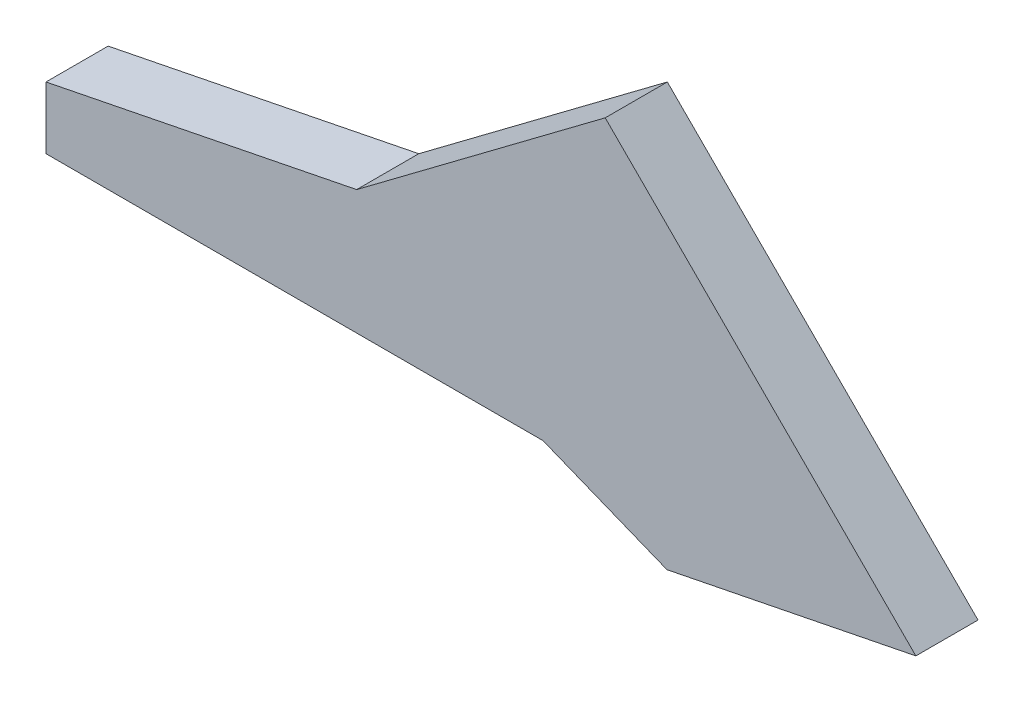
ISO-10303-21;
HEADER;
FILE_DESCRIPTION(('STEP AP214'),'2;1');
FILE_NAME('part.step','',(''),(''),'','','');
FILE_SCHEMA(('AUTOMOTIVE_DESIGN { 1 0 10303 214 1 1 1 1 }'));
ENDSEC;
DATA;
#1=APPLICATION_CONTEXT('core data for automotive mechanical design processes');
#2=APPLICATION_PROTOCOL_DEFINITION('international standard','automotive_design',2000,#1);
#3=PRODUCT_CONTEXT('',#1,'mechanical');
#4=PRODUCT('Part','Part','',(#3));
#5=PRODUCT_RELATED_PRODUCT_CATEGORY('part','',(#4));
#6=PRODUCT_DEFINITION_FORMATION('','',#4);
#7=PRODUCT_DEFINITION_CONTEXT('part definition',#1,'design');
#8=PRODUCT_DEFINITION('design','',#6,#7);
#9=PRODUCT_DEFINITION_SHAPE('','',#8);
#10=(LENGTH_UNIT() NAMED_UNIT(*) SI_UNIT(.MILLI.,.METRE.));
#11=(NAMED_UNIT(*) PLANE_ANGLE_UNIT() SI_UNIT($,.RADIAN.));
#12=(NAMED_UNIT(*) SI_UNIT($,.STERADIAN.) SOLID_ANGLE_UNIT());
#13=UNCERTAINTY_MEASURE_WITH_UNIT(LENGTH_MEASURE(1.E-05),#10,'distance_accuracy_value','');
#14=(GEOMETRIC_REPRESENTATION_CONTEXT(3) GLOBAL_UNCERTAINTY_ASSIGNED_CONTEXT((#13)) GLOBAL_UNIT_ASSIGNED_CONTEXT((#10,
#11,#12)) REPRESENTATION_CONTEXT('',''));
#15=CARTESIAN_POINT('',(0.,0.,0.));
#16=DIRECTION('',(0.,0.,1.));
#17=DIRECTION('',(1.,0.,0.));
#18=AXIS2_PLACEMENT_3D('',#15,#16,#17);
#19=CARTESIAN_POINT('',(-0.999999977648,0.,0.3));
#20=DIRECTION('',(-1.,0.,0.));
#21=DIRECTION('',(0.,-1.,0.));
#22=AXIS2_PLACEMENT_3D('',#19,#20,#21);
#23=PLANE('',#22);
#24=DIRECTION('',(0.,1.,0.));
#25=VECTOR('',#24,1.);
#26=CARTESIAN_POINT('',(-0.999999977648,-0.09999999776483,0.3));
#27=LINE('',#26,#25);
#28=CARTESIAN_POINT('',(-0.999999977648,-0.09999999776483,0.3));
#29=VERTEX_POINT('',#28);
#30=CARTESIAN_POINT('',(-0.999999977648,0.,0.3));
#31=VERTEX_POINT('',#30);
#32=EDGE_CURVE('E35',#29,#31,#27,.T.);
#33=ORIENTED_EDGE('',*,*,#32,.F.);
#34=DIRECTION('',(0.,0.,1.));
#35=VECTOR('',#34,1.);
#36=CARTESIAN_POINT('',(-0.999999977648,-0.09999999776483,0.3));
#37=LINE('',#36,#35);
#38=CARTESIAN_POINT('',(-0.999999977648,-0.09999999776483,0.4));
#39=VERTEX_POINT('',#38);
#40=EDGE_CURVE('E11',#29,#39,#37,.T.);
#41=ORIENTED_EDGE('',*,*,#40,.T.);
#42=DIRECTION('',(0.,-1.,0.));
#43=VECTOR('',#42,1.);
#44=CARTESIAN_POINT('',(-0.999999977648,-0.09999999776483,0.4));
#45=LINE('',#44,#43);
#46=CARTESIAN_POINT('',(-0.999999977648,0.,0.4));
#47=VERTEX_POINT('',#46);
#48=EDGE_CURVE('E98',#47,#39,#45,.T.);
#49=ORIENTED_EDGE('',*,*,#48,.F.);
#50=DIRECTION('',(0.,0.,1.));
#51=VECTOR('',#50,1.);
#52=CARTESIAN_POINT('',(-0.999999977648,0.,0.3));
#53=LINE('',#52,#51);
#54=EDGE_CURVE('E27',#31,#47,#53,.T.);
#55=ORIENTED_EDGE('',*,*,#54,.F.);
#56=EDGE_LOOP('',(#33,#41,#49,#55));
#57=FACE_BOUND('',#56,.T.);
#58=ADVANCED_FACE('F17',(#57),#23,.T.);
#59=CARTESIAN_POINT('',(-0.499999988824,0.09999999776483,0.3));
#60=DIRECTION('',(-0.196116135137992,0.980580675690959,0.));
#61=DIRECTION('',(-0.980580675690959,-0.196116135137992,0.));
#62=AXIS2_PLACEMENT_3D('',#59,#60,#61);
#63=PLANE('',#62);
#64=DIRECTION('',(0.980580675690959,0.196116135137992,0.));
#65=VECTOR('',#64,1.);
#66=CARTESIAN_POINT('',(-0.999999977648,0.,0.3));
#67=LINE('',#66,#65);
#68=CARTESIAN_POINT('',(-0.499999988824,0.09999999776483,0.3));
#69=VERTEX_POINT('',#68);
#70=EDGE_CURVE('E103',#31,#69,#67,.T.);
#71=ORIENTED_EDGE('',*,*,#70,.F.);
#72=ORIENTED_EDGE('',*,*,#54,.T.);
#73=DIRECTION('',(-0.980580675690959,-0.196116135137992,0.));
#74=VECTOR('',#73,1.);
#75=CARTESIAN_POINT('',(-0.999999977648,0.,0.4));
#76=LINE('',#75,#74);
#77=CARTESIAN_POINT('',(-0.499999988824,0.09999999776483,0.4));
#78=VERTEX_POINT('',#77);
#79=EDGE_CURVE('E100',#78,#47,#76,.T.);
#80=ORIENTED_EDGE('',*,*,#79,.F.);
#81=DIRECTION('',(0.,0.,1.));
#82=VECTOR('',#81,1.);
#83=CARTESIAN_POINT('',(-0.499999988824,0.09999999776483,0.3));
#84=LINE('',#83,#82);
#85=EDGE_CURVE('E124',#69,#78,#84,.T.);
#86=ORIENTED_EDGE('',*,*,#85,.F.);
#87=EDGE_LOOP('',(#71,#72,#80,#86));
#88=FACE_BOUND('',#87,.T.);
#89=ADVANCED_FACE('F133',(#88),#63,.T.);
#90=CARTESIAN_POINT('',(-0.09999999776483,0.399999991059,0.3));
#91=DIRECTION('',(-0.6,0.8,0.));
#92=DIRECTION('',(-0.8,-0.6,0.));
#93=AXIS2_PLACEMENT_3D('',#90,#91,#92);
#94=PLANE('',#93);
#95=DIRECTION('',(0.8,0.6,0.));
#96=VECTOR('',#95,1.);
#97=CARTESIAN_POINT('',(-0.499999988824,0.09999999776483,0.3));
#98=LINE('',#97,#96);
#99=CARTESIAN_POINT('',(-0.09999999776483,0.399999991059,0.3));
#100=VERTEX_POINT('',#99);
#101=EDGE_CURVE('E121',#69,#100,#98,.T.);
#102=ORIENTED_EDGE('',*,*,#101,.F.);
#103=ORIENTED_EDGE('',*,*,#85,.T.);
#104=DIRECTION('',(-0.8,-0.6,0.));
#105=VECTOR('',#104,1.);
#106=CARTESIAN_POINT('',(-0.499999988824,0.09999999776483,0.4));
#107=LINE('',#106,#105);
#108=CARTESIAN_POINT('',(-0.09999999776483,0.399999991059,0.4));
#109=VERTEX_POINT('',#108);
#110=EDGE_CURVE('E119',#109,#78,#107,.T.);
#111=ORIENTED_EDGE('',*,*,#110,.F.);
#112=DIRECTION('',(0.,0.,1.));
#113=VECTOR('',#112,1.);
#114=CARTESIAN_POINT('',(-0.09999999776483,0.399999991059,0.3));
#115=LINE('',#114,#113);
#116=EDGE_CURVE('E116',#100,#109,#115,.T.);
#117=ORIENTED_EDGE('',*,*,#116,.F.);
#118=EDGE_LOOP('',(#102,#103,#111,#117));
#119=FACE_BOUND('',#118,.T.);
#120=ADVANCED_FACE('F140',(#119),#94,.T.);
#121=CARTESIAN_POINT('',(0.399999991059,-0.09999999776483,0.3));
#122=DIRECTION('',(0.707106781186548,0.707106781186548,0.));
#123=DIRECTION('',(-0.707106781186548,0.707106781186548,0.));
#124=AXIS2_PLACEMENT_3D('',#121,#122,#123);
#125=PLANE('',#124);
#126=DIRECTION('',(0.707106781186548,-0.707106781186548,0.));
#127=VECTOR('',#126,1.);
#128=CARTESIAN_POINT('',(-0.09999999776483,0.399999991059,0.3));
#129=LINE('',#128,#127);
#130=CARTESIAN_POINT('',(0.399999991059,-0.09999999776483,0.3));
#131=VERTEX_POINT('',#130);
#132=EDGE_CURVE('E113',#100,#131,#129,.T.);
#133=ORIENTED_EDGE('',*,*,#132,.F.);
#134=ORIENTED_EDGE('',*,*,#116,.T.);
#135=DIRECTION('',(-0.707106781186548,0.707106781186548,0.));
#136=VECTOR('',#135,1.);
#137=CARTESIAN_POINT('',(-0.09999999776483,0.399999991059,0.4));
#138=LINE('',#137,#136);
#139=CARTESIAN_POINT('',(0.399999991059,-0.09999999776483,0.4));
#140=VERTEX_POINT('',#139);
#141=EDGE_CURVE('E111',#140,#109,#138,.T.);
#142=ORIENTED_EDGE('',*,*,#141,.F.);
#143=DIRECTION('',(0.,0.,1.));
#144=VECTOR('',#143,1.);
#145=CARTESIAN_POINT('',(0.399999991059,-0.09999999776483,0.3));
#146=LINE('',#145,#144);
#147=EDGE_CURVE('E109',#131,#140,#146,.T.);
#148=ORIENTED_EDGE('',*,*,#147,.F.);
#149=EDGE_LOOP('',(#133,#134,#142,#148));
#150=FACE_BOUND('',#149,.T.);
#151=ADVANCED_FACE('F142',(#150),#125,.T.);
#152=CARTESIAN_POINT('',(-0.0005978718502263,-0.180119570347,0.3));
#153=DIRECTION('',(0.196116135137992,-0.980580675690959,0.));
#154=DIRECTION('',(0.980580675690959,0.196116135137992,0.));
#155=AXIS2_PLACEMENT_3D('',#152,#153,#154);
#156=PLANE('',#155);
#157=DIRECTION('',(-0.980580675690959,-0.196116135137992,0.));
#158=VECTOR('',#157,1.);
#159=CARTESIAN_POINT('',(0.399999991059,-0.09999999776483,0.3));
#160=LINE('',#159,#158);
#161=CARTESIAN_POINT('',(-0.000597871850226,-0.180119570347,0.3));
#162=VERTEX_POINT('',#161);
#163=EDGE_CURVE('E107',#131,#162,#160,.T.);
#164=ORIENTED_EDGE('',*,*,#163,.F.);
#165=ORIENTED_EDGE('',*,*,#147,.T.);
#166=DIRECTION('',(0.980580675690959,0.196116135137992,0.));
#167=VECTOR('',#166,1.);
#168=CARTESIAN_POINT('',(0.399999991059,-0.09999999776483,0.4));
#169=LINE('',#168,#167);
#170=CARTESIAN_POINT('',(-0.000597871850226,-0.180119570347,0.4));
#171=VERTEX_POINT('',#170);
#172=EDGE_CURVE('E89',#171,#140,#169,.T.);
#173=ORIENTED_EDGE('',*,*,#172,.F.);
#174=DIRECTION('',(0.,0.,1.));
#175=VECTOR('',#174,1.);
#176=CARTESIAN_POINT('',(-0.0005978718502263,-0.180119570347,0.3));
#177=LINE('',#176,#175);
#178=EDGE_CURVE('E85',#162,#171,#177,.T.);
#179=ORIENTED_EDGE('',*,*,#178,.F.);
#180=EDGE_LOOP('',(#164,#165,#173,#179));
#181=FACE_BOUND('',#180,.T.);
#182=ADVANCED_FACE('F145',(#181),#156,.T.);
#183=CARTESIAN_POINT('',(-0.19999999553,-0.09999999776483,0.3));
#184=DIRECTION('',(-0.37282926987699,-0.927899959867975,0.));
#185=DIRECTION('',(0.927899959867975,-0.37282926987699,0.));
#186=AXIS2_PLACEMENT_3D('',#183,#184,#185);
#187=PLANE('',#186);
#188=DIRECTION('',(-0.927899959867975,0.37282926987699,0.));
#189=VECTOR('',#188,1.);
#190=CARTESIAN_POINT('',(-0.0005978718502263,-0.180119570347,0.3));
#191=LINE('',#190,#189);
#192=CARTESIAN_POINT('',(-0.19999999553,-0.09999999776483,0.3));
#193=VERTEX_POINT('',#192);
#194=EDGE_CURVE('E73',#162,#193,#191,.T.);
#195=ORIENTED_EDGE('',*,*,#194,.F.);
#196=ORIENTED_EDGE('',*,*,#178,.T.);
#197=DIRECTION('',(0.927899959867975,-0.37282926987699,0.));
#198=VECTOR('',#197,1.);
#199=CARTESIAN_POINT('',(-0.0005978718502263,-0.180119570347,0.4));
#200=LINE('',#199,#198);
#201=CARTESIAN_POINT('',(-0.19999999553,-0.09999999776483,0.4));
#202=VERTEX_POINT('',#201);
#203=EDGE_CURVE('E79',#202,#171,#200,.T.);
#204=ORIENTED_EDGE('',*,*,#203,.F.);
#205=DIRECTION('',(0.,0.,1.));
#206=VECTOR('',#205,1.);
#207=CARTESIAN_POINT('',(-0.19999999553,-0.09999999776483,0.3));
#208=LINE('',#207,#206);
#209=EDGE_CURVE('E82',#193,#202,#208,.T.);
#210=ORIENTED_EDGE('',*,*,#209,.F.);
#211=EDGE_LOOP('',(#195,#196,#204,#210));
#212=FACE_BOUND('',#211,.T.);
#213=ADVANCED_FACE('F81',(#212),#187,.T.);
#214=CARTESIAN_POINT('',(-0.999999977648,-0.09999999776483,0.3));
#215=DIRECTION('',(0.,-1.,0.));
#216=DIRECTION('',(1.,0.,0.));
#217=AXIS2_PLACEMENT_3D('',#214,#215,#216);
#218=PLANE('',#217);
#219=DIRECTION('',(-1.,0.,0.));
#220=VECTOR('',#219,1.);
#221=CARTESIAN_POINT('',(-0.19999999553,-0.09999999776483,0.3));
#222=LINE('',#221,#220);
#223=EDGE_CURVE('E94',#193,#29,#222,.T.);
#224=ORIENTED_EDGE('',*,*,#223,.F.);
#225=ORIENTED_EDGE('',*,*,#209,.T.);
#226=DIRECTION('',(1.,0.,0.));
#227=VECTOR('',#226,1.);
#228=CARTESIAN_POINT('',(-0.19999999553,-0.09999999776483,0.4));
#229=LINE('',#228,#227);
#230=EDGE_CURVE('E21',#39,#202,#229,.T.);
#231=ORIENTED_EDGE('',*,*,#230,.F.);
#232=ORIENTED_EDGE('',*,*,#40,.F.);
#233=EDGE_LOOP('',(#224,#225,#231,#232));
#234=FACE_BOUND('',#233,.T.);
#235=ADVANCED_FACE('F93',(#234),#218,.T.);
#236=CARTESIAN_POINT('',(-0.299999993294,0.109940210356,0.4));
#237=DIRECTION('',(0.,0.,1.));
#238=DIRECTION('',(1.,0.,0.));
#239=AXIS2_PLACEMENT_3D('',#236,#237,#238);
#240=PLANE('',#239);
#241=ORIENTED_EDGE('',*,*,#230,.T.);
#242=ORIENTED_EDGE('',*,*,#203,.T.);
#243=ORIENTED_EDGE('',*,*,#172,.T.);
#244=ORIENTED_EDGE('',*,*,#141,.T.);
#245=ORIENTED_EDGE('',*,*,#110,.T.);
#246=ORIENTED_EDGE('',*,*,#79,.T.);
#247=ORIENTED_EDGE('',*,*,#48,.T.);
#248=EDGE_LOOP('',(#241,#242,#243,#244,#245,#246,#247));
#249=FACE_BOUND('',#248,.T.);
#250=ADVANCED_FACE('F96',(#249),#240,.T.);
#251=CARTESIAN_POINT('',(-0.299999993294,0.109940210356,0.3));
#252=DIRECTION('',(0.,0.,1.));
#253=DIRECTION('',(1.,0.,0.));
#254=AXIS2_PLACEMENT_3D('',#251,#252,#253);
#255=PLANE('',#254);
#256=ORIENTED_EDGE('',*,*,#223,.T.);
#257=ORIENTED_EDGE('',*,*,#32,.T.);
#258=ORIENTED_EDGE('',*,*,#70,.T.);
#259=ORIENTED_EDGE('',*,*,#101,.T.);
#260=ORIENTED_EDGE('',*,*,#132,.T.);
#261=ORIENTED_EDGE('',*,*,#163,.T.);
#262=ORIENTED_EDGE('',*,*,#194,.T.);
#263=EDGE_LOOP('',(#256,#257,#258,#259,#260,#261,#262));
#264=FACE_BOUND('',#263,.T.);
#265=ADVANCED_FACE('F19',(#264),#255,.F.);
#266=CLOSED_SHELL('',(#58,#89,#120,#151,#182,#213,#235,#250,#265));
#267=MANIFOLD_SOLID_BREP('B1',#266);
#268=ADVANCED_BREP_SHAPE_REPRESENTATION('',(#18,#267),#14);
#269=SHAPE_DEFINITION_REPRESENTATION(#9,#268);
ENDSEC;
END-ISO-10303-21;
